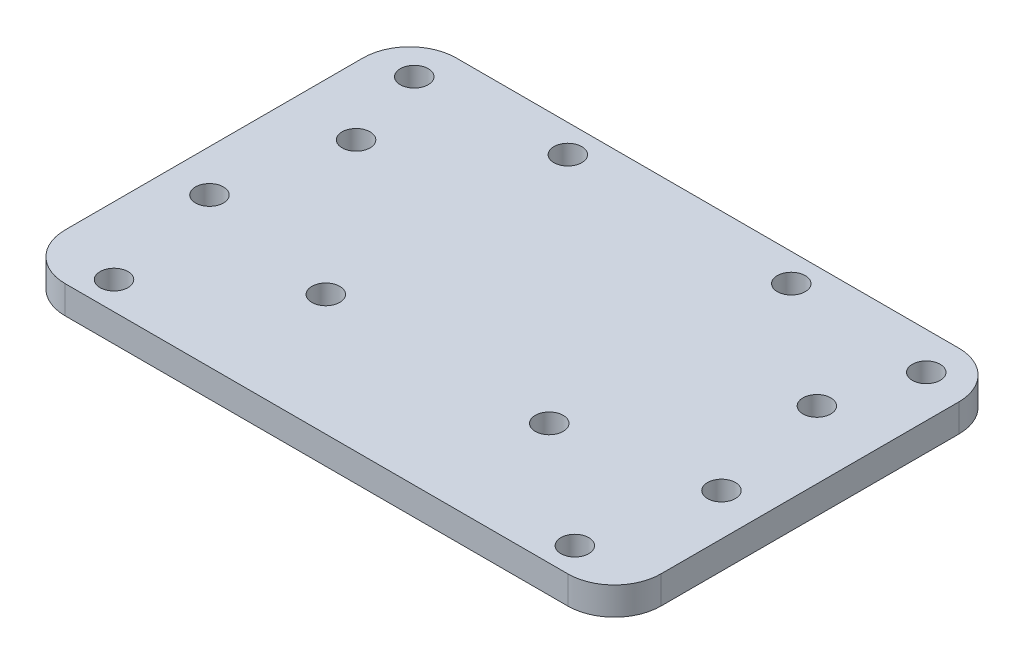
ISO-10303-21;
HEADER;
FILE_DESCRIPTION(('STEP AP214'),'2;1');
FILE_NAME('part.step','',(''),(''),'','','');
FILE_SCHEMA(('AUTOMOTIVE_DESIGN { 1 0 10303 214 1 1 1 1 }'));
ENDSEC;
DATA;
#1=APPLICATION_CONTEXT('core data for automotive mechanical design processes');
#2=APPLICATION_PROTOCOL_DEFINITION('international standard','automotive_design',2000,#1);
#3=PRODUCT_CONTEXT('',#1,'mechanical');
#4=PRODUCT('Part','Part','',(#3));
#5=PRODUCT_RELATED_PRODUCT_CATEGORY('part','',(#4));
#6=PRODUCT_DEFINITION_FORMATION('','',#4);
#7=PRODUCT_DEFINITION_CONTEXT('part definition',#1,'design');
#8=PRODUCT_DEFINITION('design','',#6,#7);
#9=PRODUCT_DEFINITION_SHAPE('','',#8);
#10=(LENGTH_UNIT() NAMED_UNIT(*) SI_UNIT(.MILLI.,.METRE.));
#11=(NAMED_UNIT(*) PLANE_ANGLE_UNIT() SI_UNIT($,.RADIAN.));
#12=(NAMED_UNIT(*) SI_UNIT($,.STERADIAN.) SOLID_ANGLE_UNIT());
#13=UNCERTAINTY_MEASURE_WITH_UNIT(LENGTH_MEASURE(1.E-05),#10,'distance_accuracy_value','');
#14=(GEOMETRIC_REPRESENTATION_CONTEXT(3) GLOBAL_UNCERTAINTY_ASSIGNED_CONTEXT((#13)) GLOBAL_UNIT_ASSIGNED_CONTEXT((#10,
#11,#12)) REPRESENTATION_CONTEXT('',''));
#15=CARTESIAN_POINT('',(0.,0.,0.));
#16=DIRECTION('',(0.,0.,1.));
#17=DIRECTION('',(1.,0.,0.));
#18=AXIS2_PLACEMENT_3D('',#15,#16,#17);
#19=CARTESIAN_POINT('',(-32.,3.,0.));
#20=DIRECTION('',(-1.,0.,0.));
#21=DIRECTION('',(0.,0.,1.));
#22=AXIS2_PLACEMENT_3D('',#19,#20,#21);
#23=PLANE('',#22);
#24=DIRECTION('',(0.,0.,-1.));
#25=VECTOR('',#24,1.);
#26=CARTESIAN_POINT('',(-32.,0.,0.));
#27=LINE('',#26,#25);
#28=CARTESIAN_POINT('',(-32.,0.,21.));
#29=VERTEX_POINT('',#28);
#30=CARTESIAN_POINT('',(-32.,0.,-11.));
#31=VERTEX_POINT('',#30);
#32=EDGE_CURVE('E136',#29,#31,#27,.T.);
#33=ORIENTED_EDGE('',*,*,#32,.F.);
#34=DIRECTION('',(0.,-1.,0.));
#35=VECTOR('',#34,1.);
#36=CARTESIAN_POINT('',(-32.,3.,21.));
#37=LINE('',#36,#35);
#38=CARTESIAN_POINT('',(-32.,3.,21.));
#39=VERTEX_POINT('',#38);
#40=EDGE_CURVE('E113',#29,#39,#37,.F.);
#41=ORIENTED_EDGE('',*,*,#40,.T.);
#42=DIRECTION('',(0.,0.,-1.));
#43=VECTOR('',#42,1.);
#44=CARTESIAN_POINT('',(-32.,3.,0.));
#45=LINE('',#44,#43);
#46=CARTESIAN_POINT('',(-32.,3.,-11.));
#47=VERTEX_POINT('',#46);
#48=EDGE_CURVE('E323',#39,#47,#45,.T.);
#49=ORIENTED_EDGE('',*,*,#48,.T.);
#50=DIRECTION('',(0.,-1.,0.));
#51=VECTOR('',#50,1.);
#52=CARTESIAN_POINT('',(-32.,3.,-11.));
#53=LINE('',#52,#51);
#54=EDGE_CURVE('E118',#47,#31,#53,.T.);
#55=ORIENTED_EDGE('',*,*,#54,.T.);
#56=EDGE_LOOP('',(#33,#41,#49,#55));
#57=FACE_BOUND('',#56,.T.);
#58=ADVANCED_FACE('F42',(#57),#23,.T.);
#59=CARTESIAN_POINT('',(0.,3.,26.));
#60=DIRECTION('',(0.,0.,-1.));
#61=DIRECTION('',(-1.,0.,0.));
#62=AXIS2_PLACEMENT_3D('',#59,#60,#61);
#63=PLANE('',#62);
#64=DIRECTION('',(1.,0.,0.));
#65=VECTOR('',#64,1.);
#66=CARTESIAN_POINT('',(0.,3.,26.));
#67=LINE('',#66,#65);
#68=CARTESIAN_POINT('',(-27.,3.,26.));
#69=VERTEX_POINT('',#68);
#70=CARTESIAN_POINT('',(27.,3.,26.));
#71=VERTEX_POINT('',#70);
#72=EDGE_CURVE('E128',#69,#71,#67,.T.);
#73=ORIENTED_EDGE('',*,*,#72,.F.);
#74=DIRECTION('',(0.,-1.,0.));
#75=VECTOR('',#74,1.);
#76=CARTESIAN_POINT('',(-27.,0.,26.));
#77=LINE('',#76,#75);
#78=CARTESIAN_POINT('',(-27.,0.,26.));
#79=VERTEX_POINT('',#78);
#80=EDGE_CURVE('E112',#69,#79,#77,.T.);
#81=ORIENTED_EDGE('',*,*,#80,.T.);
#82=DIRECTION('',(1.,0.,0.));
#83=VECTOR('',#82,1.);
#84=CARTESIAN_POINT('',(0.,0.,26.));
#85=LINE('',#84,#83);
#86=CARTESIAN_POINT('',(27.,0.,26.));
#87=VERTEX_POINT('',#86);
#88=EDGE_CURVE('E125',#79,#87,#85,.T.);
#89=ORIENTED_EDGE('',*,*,#88,.T.);
#90=DIRECTION('',(0.,-1.,0.));
#91=VECTOR('',#90,1.);
#92=CARTESIAN_POINT('',(27.,3.,26.));
#93=LINE('',#92,#91);
#94=EDGE_CURVE('E130',#87,#71,#93,.F.);
#95=ORIENTED_EDGE('',*,*,#94,.T.);
#96=EDGE_LOOP('',(#73,#81,#89,#95));
#97=FACE_BOUND('',#96,.T.);
#98=ADVANCED_FACE('F124',(#97),#63,.F.);
#99=CARTESIAN_POINT('',(32.,3.,0.));
#100=DIRECTION('',(-1.,0.,0.));
#101=DIRECTION('',(0.,0.,1.));
#102=AXIS2_PLACEMENT_3D('',#99,#100,#101);
#103=PLANE('',#102);
#104=DIRECTION('',(0.,0.,-1.));
#105=VECTOR('',#104,1.);
#106=CARTESIAN_POINT('',(32.,3.,0.));
#107=LINE('',#106,#105);
#108=CARTESIAN_POINT('',(32.,3.,21.));
#109=VERTEX_POINT('',#108);
#110=CARTESIAN_POINT('',(32.,3.,-11.));
#111=VERTEX_POINT('',#110);
#112=EDGE_CURVE('E194',#109,#111,#107,.T.);
#113=ORIENTED_EDGE('',*,*,#112,.F.);
#114=DIRECTION('',(0.,-1.,0.));
#115=VECTOR('',#114,1.);
#116=CARTESIAN_POINT('',(32.,3.,21.));
#117=LINE('',#116,#115);
#118=CARTESIAN_POINT('',(32.,0.,21.));
#119=VERTEX_POINT('',#118);
#120=EDGE_CURVE('E187',#109,#119,#117,.T.);
#121=ORIENTED_EDGE('',*,*,#120,.T.);
#122=DIRECTION('',(0.,0.,-1.));
#123=VECTOR('',#122,1.);
#124=CARTESIAN_POINT('',(32.,0.,0.));
#125=LINE('',#124,#123);
#126=CARTESIAN_POINT('',(32.,0.,-11.));
#127=VERTEX_POINT('',#126);
#128=EDGE_CURVE('E135',#119,#127,#125,.T.);
#129=ORIENTED_EDGE('',*,*,#128,.T.);
#130=DIRECTION('',(0.,-1.,0.));
#131=VECTOR('',#130,1.);
#132=CARTESIAN_POINT('',(32.,3.,-11.));
#133=LINE('',#132,#131);
#134=EDGE_CURVE('E185',#127,#111,#133,.F.);
#135=ORIENTED_EDGE('',*,*,#134,.T.);
#136=EDGE_LOOP('',(#113,#121,#129,#135));
#137=FACE_BOUND('',#136,.T.);
#138=ADVANCED_FACE('F192',(#137),#103,.F.);
#139=CARTESIAN_POINT('',(-24.75,3.,23.));
#140=DIRECTION('',(0.,-1.,0.));
#141=DIRECTION('',(0.,0.,-1.));
#142=AXIS2_PLACEMENT_3D('',#139,#140,#141);
#143=CYLINDRICAL_SURFACE('',#142,1.5);
#144=CARTESIAN_POINT('',(-24.75,3.,23.));
#145=DIRECTION('',(0.,1.,0.));
#146=DIRECTION('',(0.,0.,1.));
#147=AXIS2_PLACEMENT_3D('',#144,#145,#146);
#148=CIRCLE('',#147,1.5);
#149=CARTESIAN_POINT('',(-24.75,3.,24.5));
#150=VERTEX_POINT('',#149);
#151=EDGE_CURVE('E222',#150,#150,#148,.T.);
#152=ORIENTED_EDGE('',*,*,#151,.T.);
#153=EDGE_LOOP('',(#152));
#154=FACE_BOUND('',#153,.T.);
#155=CARTESIAN_POINT('',(-24.75,0.,23.));
#156=DIRECTION('',(0.,1.,0.));
#157=DIRECTION('',(0.,0.,1.));
#158=AXIS2_PLACEMENT_3D('',#155,#156,#157);
#159=CIRCLE('',#158,1.5);
#160=CARTESIAN_POINT('',(-24.75,0.,24.5));
#161=VERTEX_POINT('',#160);
#162=EDGE_CURVE('E162',#161,#161,#159,.T.);
#163=ORIENTED_EDGE('',*,*,#162,.F.);
#164=EDGE_LOOP('',(#163));
#165=FACE_BOUND('',#164,.T.);
#166=ADVANCED_FACE('F266',(#154,#165),#143,.F.);
#167=CARTESIAN_POINT('',(-12.,3.,-13.));
#168=DIRECTION('',(0.,-1.,0.));
#169=DIRECTION('',(0.,0.,-1.));
#170=AXIS2_PLACEMENT_3D('',#167,#168,#169);
#171=CYLINDRICAL_SURFACE('',#170,1.5);
#172=CARTESIAN_POINT('',(-12.,3.,-13.));
#173=DIRECTION('',(0.,1.,0.));
#174=DIRECTION('',(0.,0.,1.));
#175=AXIS2_PLACEMENT_3D('',#172,#173,#174);
#176=CIRCLE('',#175,1.5);
#177=CARTESIAN_POINT('',(-12.,3.,-11.5));
#178=VERTEX_POINT('',#177);
#179=EDGE_CURVE('E219',#178,#178,#176,.F.);
#180=ORIENTED_EDGE('',*,*,#179,.F.);
#181=EDGE_LOOP('',(#180));
#182=FACE_BOUND('',#181,.T.);
#183=CARTESIAN_POINT('',(-12.,0.,-13.));
#184=DIRECTION('',(0.,1.,0.));
#185=DIRECTION('',(0.,0.,1.));
#186=AXIS2_PLACEMENT_3D('',#183,#184,#185);
#187=CIRCLE('',#186,1.5);
#188=CARTESIAN_POINT('',(-12.,0.,-11.5));
#189=VERTEX_POINT('',#188);
#190=EDGE_CURVE('E159',#189,#189,#187,.F.);
#191=ORIENTED_EDGE('',*,*,#190,.T.);
#192=EDGE_LOOP('',(#191));
#193=FACE_BOUND('',#192,.T.);
#194=ADVANCED_FACE('F282',(#182,#193),#171,.F.);
#195=CARTESIAN_POINT('',(-12.,3.,13.));
#196=DIRECTION('',(0.,-1.,0.));
#197=DIRECTION('',(0.,0.,-1.));
#198=AXIS2_PLACEMENT_3D('',#195,#196,#197);
#199=CYLINDRICAL_SURFACE('',#198,1.5);
#200=CARTESIAN_POINT('',(-12.,3.,13.));
#201=DIRECTION('',(0.,1.,0.));
#202=DIRECTION('',(0.,0.,1.));
#203=AXIS2_PLACEMENT_3D('',#200,#201,#202);
#204=CIRCLE('',#203,1.5);
#205=CARTESIAN_POINT('',(-12.,3.,14.5));
#206=VERTEX_POINT('',#205);
#207=EDGE_CURVE('E216',#206,#206,#204,.T.);
#208=ORIENTED_EDGE('',*,*,#207,.T.);
#209=EDGE_LOOP('',(#208));
#210=FACE_BOUND('',#209,.T.);
#211=CARTESIAN_POINT('',(-12.,0.,13.));
#212=DIRECTION('',(0.,1.,0.));
#213=DIRECTION('',(0.,0.,1.));
#214=AXIS2_PLACEMENT_3D('',#211,#212,#213);
#215=CIRCLE('',#214,1.5);
#216=CARTESIAN_POINT('',(-12.,0.,14.5));
#217=VERTEX_POINT('',#216);
#218=EDGE_CURVE('E156',#217,#217,#215,.T.);
#219=ORIENTED_EDGE('',*,*,#218,.F.);
#220=EDGE_LOOP('',(#219));
#221=FACE_BOUND('',#220,.T.);
#222=ADVANCED_FACE('F278',(#210,#221),#199,.F.);
#223=CARTESIAN_POINT('',(-24.75,3.,-3.));
#224=DIRECTION('',(0.,-1.,0.));
#225=DIRECTION('',(0.,0.,-1.));
#226=AXIS2_PLACEMENT_3D('',#223,#224,#225);
#227=CYLINDRICAL_SURFACE('',#226,1.5);
#228=CARTESIAN_POINT('',(-24.75,3.,-3.));
#229=DIRECTION('',(0.,1.,0.));
#230=DIRECTION('',(0.,0.,1.));
#231=AXIS2_PLACEMENT_3D('',#228,#229,#230);
#232=CIRCLE('',#231,1.5);
#233=CARTESIAN_POINT('',(-24.75,3.,-1.5));
#234=VERTEX_POINT('',#233);
#235=EDGE_CURVE('E213',#234,#234,#232,.F.);
#236=ORIENTED_EDGE('',*,*,#235,.F.);
#237=EDGE_LOOP('',(#236));
#238=FACE_BOUND('',#237,.T.);
#239=CARTESIAN_POINT('',(-24.75,0.,-3.));
#240=DIRECTION('',(0.,1.,0.));
#241=DIRECTION('',(0.,0.,1.));
#242=AXIS2_PLACEMENT_3D('',#239,#240,#241);
#243=CIRCLE('',#242,1.5);
#244=CARTESIAN_POINT('',(-24.75,0.,-1.5));
#245=VERTEX_POINT('',#244);
#246=EDGE_CURVE('E153',#245,#245,#243,.F.);
#247=ORIENTED_EDGE('',*,*,#246,.T.);
#248=EDGE_LOOP('',(#247));
#249=FACE_BOUND('',#248,.T.);
#250=ADVANCED_FACE('F274',(#238,#249),#227,.F.);
#251=CARTESIAN_POINT('',(-27.5,3.,-12.));
#252=DIRECTION('',(0.,-1.,0.));
#253=DIRECTION('',(0.,0.,-1.));
#254=AXIS2_PLACEMENT_3D('',#251,#252,#253);
#255=CYLINDRICAL_SURFACE('',#254,1.5);
#256=CARTESIAN_POINT('',(-27.5,3.,-12.));
#257=DIRECTION('',(0.,1.,0.));
#258=DIRECTION('',(0.,0.,1.));
#259=AXIS2_PLACEMENT_3D('',#256,#257,#258);
#260=CIRCLE('',#259,1.5);
#261=CARTESIAN_POINT('',(-27.5,3.,-10.5));
#262=VERTEX_POINT('',#261);
#263=EDGE_CURVE('E206',#262,#262,#260,.F.);
#264=ORIENTED_EDGE('',*,*,#263,.F.);
#265=EDGE_LOOP('',(#264));
#266=FACE_BOUND('',#265,.T.);
#267=CARTESIAN_POINT('',(-27.5,0.,-12.));
#268=DIRECTION('',(0.,1.,0.));
#269=DIRECTION('',(0.,0.,1.));
#270=AXIS2_PLACEMENT_3D('',#267,#268,#269);
#271=CIRCLE('',#270,1.5);
#272=CARTESIAN_POINT('',(-27.5,0.,-10.5));
#273=VERTEX_POINT('',#272);
#274=EDGE_CURVE('E150',#273,#273,#271,.F.);
#275=ORIENTED_EDGE('',*,*,#274,.T.);
#276=EDGE_LOOP('',(#275));
#277=FACE_BOUND('',#276,.T.);
#278=ADVANCED_FACE('F270',(#266,#277),#255,.F.);
#279=CARTESIAN_POINT('',(27.5,3.,-12.));
#280=DIRECTION('',(0.,-1.,0.));
#281=DIRECTION('',(0.,0.,-1.));
#282=AXIS2_PLACEMENT_3D('',#279,#280,#281);
#283=CYLINDRICAL_SURFACE('',#282,1.5);
#284=CARTESIAN_POINT('',(27.5,3.,-12.));
#285=DIRECTION('',(0.,1.,0.));
#286=DIRECTION('',(0.,0.,1.));
#287=AXIS2_PLACEMENT_3D('',#284,#285,#286);
#288=CIRCLE('',#287,1.5);
#289=CARTESIAN_POINT('',(27.5,3.,-10.5));
#290=VERTEX_POINT('',#289);
#291=EDGE_CURVE('E203',#290,#290,#288,.T.);
#292=ORIENTED_EDGE('',*,*,#291,.T.);
#293=EDGE_LOOP('',(#292));
#294=FACE_BOUND('',#293,.T.);
#295=CARTESIAN_POINT('',(27.5,0.,-12.));
#296=DIRECTION('',(0.,1.,0.));
#297=DIRECTION('',(0.,0.,1.));
#298=AXIS2_PLACEMENT_3D('',#295,#296,#297);
#299=CIRCLE('',#298,1.5);
#300=CARTESIAN_POINT('',(27.5,0.,-10.5));
#301=VERTEX_POINT('',#300);
#302=EDGE_CURVE('E147',#301,#301,#299,.T.);
#303=ORIENTED_EDGE('',*,*,#302,.F.);
#304=EDGE_LOOP('',(#303));
#305=FACE_BOUND('',#304,.T.);
#306=ADVANCED_FACE('F254',(#294,#305),#283,.F.);
#307=CARTESIAN_POINT('',(0.,3.,-16.));
#308=DIRECTION('',(0.,0.,-1.));
#309=DIRECTION('',(-1.,0.,0.));
#310=AXIS2_PLACEMENT_3D('',#307,#308,#309);
#311=PLANE('',#310);
#312=DIRECTION('',(1.,0.,0.));
#313=VECTOR('',#312,1.);
#314=CARTESIAN_POINT('',(0.,3.,-16.));
#315=LINE('',#314,#313);
#316=CARTESIAN_POINT('',(-27.,3.,-16.));
#317=VERTEX_POINT('',#316);
#318=CARTESIAN_POINT('',(27.,3.,-16.));
#319=VERTEX_POINT('',#318);
#320=EDGE_CURVE('E201',#317,#319,#315,.T.);
#321=ORIENTED_EDGE('',*,*,#320,.T.);
#322=DIRECTION('',(0.,-1.,0.));
#323=VECTOR('',#322,1.);
#324=CARTESIAN_POINT('',(27.,0.,-16.));
#325=LINE('',#324,#323);
#326=CARTESIAN_POINT('',(27.,0.,-16.));
#327=VERTEX_POINT('',#326);
#328=EDGE_CURVE('E11',#319,#327,#325,.T.);
#329=ORIENTED_EDGE('',*,*,#328,.T.);
#330=DIRECTION('',(1.,0.,0.));
#331=VECTOR('',#330,1.);
#332=CARTESIAN_POINT('',(0.,0.,-16.));
#333=LINE('',#332,#331);
#334=CARTESIAN_POINT('',(-27.,0.,-16.));
#335=VERTEX_POINT('',#334);
#336=EDGE_CURVE('E139',#335,#327,#333,.T.);
#337=ORIENTED_EDGE('',*,*,#336,.F.);
#338=DIRECTION('',(0.,-1.,0.));
#339=VECTOR('',#338,1.);
#340=CARTESIAN_POINT('',(-27.,3.,-16.));
#341=LINE('',#340,#339);
#342=EDGE_CURVE('E50',#335,#317,#341,.F.);
#343=ORIENTED_EDGE('',*,*,#342,.T.);
#344=EDGE_LOOP('',(#321,#329,#337,#343));
#345=FACE_BOUND('',#344,.T.);
#346=ADVANCED_FACE('F200',(#345),#311,.T.);
#347=CARTESIAN_POINT('',(27.5,3.,10.));
#348=DIRECTION('',(0.,-1.,0.));
#349=DIRECTION('',(0.,0.,-1.));
#350=AXIS2_PLACEMENT_3D('',#347,#348,#349);
#351=CYLINDRICAL_SURFACE('',#350,1.5);
#352=CARTESIAN_POINT('',(27.5,3.,10.));
#353=DIRECTION('',(0.,1.,0.));
#354=DIRECTION('',(0.,0.,1.));
#355=AXIS2_PLACEMENT_3D('',#352,#353,#354);
#356=CIRCLE('',#355,1.5);
#357=CARTESIAN_POINT('',(27.5,3.,11.5));
#358=VERTEX_POINT('',#357);
#359=EDGE_CURVE('E319',#358,#358,#356,.T.);
#360=ORIENTED_EDGE('',*,*,#359,.T.);
#361=EDGE_LOOP('',(#360));
#362=FACE_BOUND('',#361,.T.);
#363=CARTESIAN_POINT('',(27.5,0.,10.));
#364=DIRECTION('',(0.,1.,0.));
#365=DIRECTION('',(0.,0.,1.));
#366=AXIS2_PLACEMENT_3D('',#363,#364,#365);
#367=CIRCLE('',#366,1.5);
#368=CARTESIAN_POINT('',(27.5,0.,11.5));
#369=VERTEX_POINT('',#368);
#370=EDGE_CURVE('E141',#369,#369,#367,.T.);
#371=ORIENTED_EDGE('',*,*,#370,.F.);
#372=EDGE_LOOP('',(#371));
#373=FACE_BOUND('',#372,.T.);
#374=ADVANCED_FACE('F242',(#362,#373),#351,.F.);
#375=CARTESIAN_POINT('',(24.75,3.,-3.));
#376=DIRECTION('',(0.,-1.,0.));
#377=DIRECTION('',(0.,0.,-1.));
#378=AXIS2_PLACEMENT_3D('',#375,#376,#377);
#379=CYLINDRICAL_SURFACE('',#378,1.5);
#380=CARTESIAN_POINT('',(24.75,3.,-3.));
#381=DIRECTION('',(0.,1.,0.));
#382=DIRECTION('',(0.,0.,1.));
#383=AXIS2_PLACEMENT_3D('',#380,#381,#382);
#384=CIRCLE('',#383,1.5);
#385=CARTESIAN_POINT('',(24.75,3.,-1.5));
#386=VERTEX_POINT('',#385);
#387=EDGE_CURVE('E317',#386,#386,#384,.T.);
#388=ORIENTED_EDGE('',*,*,#387,.T.);
#389=EDGE_LOOP('',(#388));
#390=FACE_BOUND('',#389,.T.);
#391=CARTESIAN_POINT('',(24.75,0.,-3.));
#392=DIRECTION('',(0.,1.,0.));
#393=DIRECTION('',(0.,0.,1.));
#394=AXIS2_PLACEMENT_3D('',#391,#392,#393);
#395=CIRCLE('',#394,1.5);
#396=CARTESIAN_POINT('',(24.75,0.,-1.5));
#397=VERTEX_POINT('',#396);
#398=EDGE_CURVE('E236',#397,#397,#395,.T.);
#399=ORIENTED_EDGE('',*,*,#398,.F.);
#400=EDGE_LOOP('',(#399));
#401=FACE_BOUND('',#400,.T.);
#402=ADVANCED_FACE('F244',(#390,#401),#379,.F.);
#403=CARTESIAN_POINT('',(-27.5,3.,10.));
#404=DIRECTION('',(0.,-1.,0.));
#405=DIRECTION('',(0.,0.,-1.));
#406=AXIS2_PLACEMENT_3D('',#403,#404,#405);
#407=CYLINDRICAL_SURFACE('',#406,1.5);
#408=CARTESIAN_POINT('',(-27.5,3.,10.));
#409=DIRECTION('',(0.,1.,0.));
#410=DIRECTION('',(0.,0.,1.));
#411=AXIS2_PLACEMENT_3D('',#408,#409,#410);
#412=CIRCLE('',#411,1.5);
#413=CARTESIAN_POINT('',(-27.5,3.,11.5));
#414=VERTEX_POINT('',#413);
#415=EDGE_CURVE('E313',#414,#414,#412,.F.);
#416=ORIENTED_EDGE('',*,*,#415,.F.);
#417=EDGE_LOOP('',(#416));
#418=FACE_BOUND('',#417,.T.);
#419=CARTESIAN_POINT('',(-27.5,0.,10.));
#420=DIRECTION('',(0.,1.,0.));
#421=DIRECTION('',(0.,0.,1.));
#422=AXIS2_PLACEMENT_3D('',#419,#420,#421);
#423=CIRCLE('',#422,1.5);
#424=CARTESIAN_POINT('',(-27.5,0.,11.5));
#425=VERTEX_POINT('',#424);
#426=EDGE_CURVE('E233',#425,#425,#423,.F.);
#427=ORIENTED_EDGE('',*,*,#426,.T.);
#428=EDGE_LOOP('',(#427));
#429=FACE_BOUND('',#428,.T.);
#430=ADVANCED_FACE('F251',(#418,#429),#407,.F.);
#431=CARTESIAN_POINT('',(12.,3.,-13.));
#432=DIRECTION('',(0.,-1.,0.));
#433=DIRECTION('',(0.,0.,-1.));
#434=AXIS2_PLACEMENT_3D('',#431,#432,#433);
#435=CYLINDRICAL_SURFACE('',#434,1.5);
#436=CARTESIAN_POINT('',(12.,3.,-13.));
#437=DIRECTION('',(0.,1.,0.));
#438=DIRECTION('',(0.,0.,1.));
#439=AXIS2_PLACEMENT_3D('',#436,#437,#438);
#440=CIRCLE('',#439,1.5);
#441=CARTESIAN_POINT('',(12.,3.,-11.5));
#442=VERTEX_POINT('',#441);
#443=EDGE_CURVE('E309',#442,#442,#440,.T.);
#444=ORIENTED_EDGE('',*,*,#443,.T.);
#445=EDGE_LOOP('',(#444));
#446=FACE_BOUND('',#445,.T.);
#447=CARTESIAN_POINT('',(12.,0.,-13.));
#448=DIRECTION('',(0.,1.,0.));
#449=DIRECTION('',(0.,0.,1.));
#450=AXIS2_PLACEMENT_3D('',#447,#448,#449);
#451=CIRCLE('',#450,1.5);
#452=CARTESIAN_POINT('',(12.,0.,-11.5));
#453=VERTEX_POINT('',#452);
#454=EDGE_CURVE('E230',#453,#453,#451,.T.);
#455=ORIENTED_EDGE('',*,*,#454,.F.);
#456=EDGE_LOOP('',(#455));
#457=FACE_BOUND('',#456,.T.);
#458=ADVANCED_FACE('F365',(#446,#457),#435,.F.);
#459=CARTESIAN_POINT('',(12.,3.,13.));
#460=DIRECTION('',(0.,-1.,0.));
#461=DIRECTION('',(0.,0.,-1.));
#462=AXIS2_PLACEMENT_3D('',#459,#460,#461);
#463=CYLINDRICAL_SURFACE('',#462,1.5);
#464=CARTESIAN_POINT('',(12.,3.,13.));
#465=DIRECTION('',(0.,1.,0.));
#466=DIRECTION('',(0.,0.,1.));
#467=AXIS2_PLACEMENT_3D('',#464,#465,#466);
#468=CIRCLE('',#467,1.5);
#469=CARTESIAN_POINT('',(12.,3.,14.5));
#470=VERTEX_POINT('',#469);
#471=EDGE_CURVE('E168',#470,#470,#468,.F.);
#472=ORIENTED_EDGE('',*,*,#471,.F.);
#473=EDGE_LOOP('',(#472));
#474=FACE_BOUND('',#473,.T.);
#475=CARTESIAN_POINT('',(12.,0.,13.));
#476=DIRECTION('',(0.,1.,0.));
#477=DIRECTION('',(0.,0.,1.));
#478=AXIS2_PLACEMENT_3D('',#475,#476,#477);
#479=CIRCLE('',#478,1.5);
#480=CARTESIAN_POINT('',(12.,0.,14.5));
#481=VERTEX_POINT('',#480);
#482=EDGE_CURVE('E227',#481,#481,#479,.F.);
#483=ORIENTED_EDGE('',*,*,#482,.T.);
#484=EDGE_LOOP('',(#483));
#485=FACE_BOUND('',#484,.T.);
#486=ADVANCED_FACE('F294',(#474,#485),#463,.F.);
#487=CARTESIAN_POINT('',(24.75,3.,23.));
#488=DIRECTION('',(0.,-1.,0.));
#489=DIRECTION('',(0.,0.,-1.));
#490=AXIS2_PLACEMENT_3D('',#487,#488,#489);
#491=CYLINDRICAL_SURFACE('',#490,1.5);
#492=CARTESIAN_POINT('',(24.75,3.,23.));
#493=DIRECTION('',(0.,1.,0.));
#494=DIRECTION('',(0.,0.,1.));
#495=AXIS2_PLACEMENT_3D('',#492,#493,#494);
#496=CIRCLE('',#495,1.5);
#497=CARTESIAN_POINT('',(24.75,3.,24.5));
#498=VERTEX_POINT('',#497);
#499=EDGE_CURVE('E169',#498,#498,#496,.F.);
#500=ORIENTED_EDGE('',*,*,#499,.F.);
#501=EDGE_LOOP('',(#500));
#502=FACE_BOUND('',#501,.T.);
#503=CARTESIAN_POINT('',(24.75,0.,23.));
#504=DIRECTION('',(0.,1.,0.));
#505=DIRECTION('',(0.,0.,1.));
#506=AXIS2_PLACEMENT_3D('',#503,#504,#505);
#507=CIRCLE('',#506,1.5);
#508=CARTESIAN_POINT('',(24.75,0.,24.5));
#509=VERTEX_POINT('',#508);
#510=EDGE_CURVE('E165',#509,#509,#507,.F.);
#511=ORIENTED_EDGE('',*,*,#510,.T.);
#512=EDGE_LOOP('',(#511));
#513=FACE_BOUND('',#512,.T.);
#514=ADVANCED_FACE('F290',(#502,#513),#491,.F.);
#515=CARTESIAN_POINT('',(0.,3.,0.));
#516=DIRECTION('',(0.,1.,0.));
#517=DIRECTION('',(0.,0.,1.));
#518=AXIS2_PLACEMENT_3D('',#515,#516,#517);
#519=PLANE('',#518);
#520=ORIENTED_EDGE('',*,*,#471,.T.);
#521=EDGE_LOOP('',(#520));
#522=FACE_BOUND('',#521,.T.);
#523=ORIENTED_EDGE('',*,*,#443,.F.);
#524=EDGE_LOOP('',(#523));
#525=FACE_BOUND('',#524,.T.);
#526=ORIENTED_EDGE('',*,*,#415,.T.);
#527=EDGE_LOOP('',(#526));
#528=FACE_BOUND('',#527,.T.);
#529=ORIENTED_EDGE('',*,*,#387,.F.);
#530=EDGE_LOOP('',(#529));
#531=FACE_BOUND('',#530,.T.);
#532=ORIENTED_EDGE('',*,*,#359,.F.);
#533=EDGE_LOOP('',(#532));
#534=FACE_BOUND('',#533,.T.);
#535=ORIENTED_EDGE('',*,*,#48,.F.);
#536=CARTESIAN_POINT('',(-27.,3.,21.));
#537=DIRECTION('',(0.,1.,0.));
#538=DIRECTION('',(0.,0.,1.));
#539=AXIS2_PLACEMENT_3D('',#536,#537,#538);
#540=CIRCLE('',#539,5.);
#541=EDGE_CURVE('E183',#39,#69,#540,.T.);
#542=ORIENTED_EDGE('',*,*,#541,.T.);
#543=ORIENTED_EDGE('',*,*,#72,.T.);
#544=CARTESIAN_POINT('',(27.,3.,21.));
#545=DIRECTION('',(0.,1.,0.));
#546=DIRECTION('',(0.,0.,1.));
#547=AXIS2_PLACEMENT_3D('',#544,#545,#546);
#548=CIRCLE('',#547,5.);
#549=EDGE_CURVE('E181',#71,#109,#548,.T.);
#550=ORIENTED_EDGE('',*,*,#549,.T.);
#551=ORIENTED_EDGE('',*,*,#112,.T.);
#552=CARTESIAN_POINT('',(27.,3.,-11.));
#553=DIRECTION('',(0.,1.,0.));
#554=DIRECTION('',(0.,0.,1.));
#555=AXIS2_PLACEMENT_3D('',#552,#553,#554);
#556=CIRCLE('',#555,5.);
#557=EDGE_CURVE('E57',#111,#319,#556,.T.);
#558=ORIENTED_EDGE('',*,*,#557,.T.);
#559=ORIENTED_EDGE('',*,*,#320,.F.);
#560=CARTESIAN_POINT('',(-27.,3.,-11.));
#561=DIRECTION('',(0.,1.,0.));
#562=DIRECTION('',(0.,0.,1.));
#563=AXIS2_PLACEMENT_3D('',#560,#561,#562);
#564=CIRCLE('',#563,5.);
#565=EDGE_CURVE('E178',#317,#47,#564,.T.);
#566=ORIENTED_EDGE('',*,*,#565,.T.);
#567=EDGE_LOOP('',(#535,#542,#543,#550,#551,#558,#559,#566));
#568=FACE_BOUND('',#567,.T.);
#569=ORIENTED_EDGE('',*,*,#291,.F.);
#570=EDGE_LOOP('',(#569));
#571=FACE_BOUND('',#570,.T.);
#572=ORIENTED_EDGE('',*,*,#263,.T.);
#573=EDGE_LOOP('',(#572));
#574=FACE_BOUND('',#573,.T.);
#575=ORIENTED_EDGE('',*,*,#235,.T.);
#576=EDGE_LOOP('',(#575));
#577=FACE_BOUND('',#576,.T.);
#578=ORIENTED_EDGE('',*,*,#207,.F.);
#579=EDGE_LOOP('',(#578));
#580=FACE_BOUND('',#579,.T.);
#581=ORIENTED_EDGE('',*,*,#179,.T.);
#582=EDGE_LOOP('',(#581));
#583=FACE_BOUND('',#582,.T.);
#584=ORIENTED_EDGE('',*,*,#151,.F.);
#585=EDGE_LOOP('',(#584));
#586=FACE_BOUND('',#585,.T.);
#587=ORIENTED_EDGE('',*,*,#499,.T.);
#588=EDGE_LOOP('',(#587));
#589=FACE_BOUND('',#588,.T.);
#590=ADVANCED_FACE('F293',(#522,#525,#528,#531,#534,#568,#571,#574,#577,#580,#583,#586,#589),
#519,.T.);
#591=CARTESIAN_POINT('',(0.,0.,0.));
#592=DIRECTION('',(0.,1.,0.));
#593=DIRECTION('',(0.,0.,1.));
#594=AXIS2_PLACEMENT_3D('',#591,#592,#593);
#595=PLANE('',#594);
#596=ORIENTED_EDGE('',*,*,#482,.F.);
#597=EDGE_LOOP('',(#596));
#598=FACE_BOUND('',#597,.T.);
#599=ORIENTED_EDGE('',*,*,#454,.T.);
#600=EDGE_LOOP('',(#599));
#601=FACE_BOUND('',#600,.T.);
#602=ORIENTED_EDGE('',*,*,#426,.F.);
#603=EDGE_LOOP('',(#602));
#604=FACE_BOUND('',#603,.T.);
#605=ORIENTED_EDGE('',*,*,#398,.T.);
#606=EDGE_LOOP('',(#605));
#607=FACE_BOUND('',#606,.T.);
#608=ORIENTED_EDGE('',*,*,#370,.T.);
#609=EDGE_LOOP('',(#608));
#610=FACE_BOUND('',#609,.T.);
#611=ORIENTED_EDGE('',*,*,#88,.F.);
#612=CARTESIAN_POINT('',(-27.,0.,21.));
#613=DIRECTION('',(0.,1.,0.));
#614=DIRECTION('',(0.,0.,1.));
#615=AXIS2_PLACEMENT_3D('',#612,#613,#614);
#616=CIRCLE('',#615,5.);
#617=EDGE_CURVE('E108',#79,#29,#616,.F.);
#618=ORIENTED_EDGE('',*,*,#617,.T.);
#619=ORIENTED_EDGE('',*,*,#32,.T.);
#620=CARTESIAN_POINT('',(-27.,0.,-11.));
#621=DIRECTION('',(0.,1.,0.));
#622=DIRECTION('',(0.,0.,1.));
#623=AXIS2_PLACEMENT_3D('',#620,#621,#622);
#624=CIRCLE('',#623,5.);
#625=EDGE_CURVE('E129',#31,#335,#624,.F.);
#626=ORIENTED_EDGE('',*,*,#625,.T.);
#627=ORIENTED_EDGE('',*,*,#336,.T.);
#628=CARTESIAN_POINT('',(27.,0.,-11.));
#629=DIRECTION('',(0.,1.,0.));
#630=DIRECTION('',(0.,0.,1.));
#631=AXIS2_PLACEMENT_3D('',#628,#629,#630);
#632=CIRCLE('',#631,5.);
#633=EDGE_CURVE('E172',#327,#127,#632,.F.);
#634=ORIENTED_EDGE('',*,*,#633,.T.);
#635=ORIENTED_EDGE('',*,*,#128,.F.);
#636=CARTESIAN_POINT('',(27.,0.,21.));
#637=DIRECTION('',(0.,1.,0.));
#638=DIRECTION('',(0.,0.,1.));
#639=AXIS2_PLACEMENT_3D('',#636,#637,#638);
#640=CIRCLE('',#639,5.);
#641=EDGE_CURVE('E119',#119,#87,#640,.F.);
#642=ORIENTED_EDGE('',*,*,#641,.T.);
#643=EDGE_LOOP('',(#611,#618,#619,#626,#627,#634,#635,#642));
#644=FACE_BOUND('',#643,.T.);
#645=ORIENTED_EDGE('',*,*,#302,.T.);
#646=EDGE_LOOP('',(#645));
#647=FACE_BOUND('',#646,.T.);
#648=ORIENTED_EDGE('',*,*,#274,.F.);
#649=EDGE_LOOP('',(#648));
#650=FACE_BOUND('',#649,.T.);
#651=ORIENTED_EDGE('',*,*,#246,.F.);
#652=EDGE_LOOP('',(#651));
#653=FACE_BOUND('',#652,.T.);
#654=ORIENTED_EDGE('',*,*,#218,.T.);
#655=EDGE_LOOP('',(#654));
#656=FACE_BOUND('',#655,.T.);
#657=ORIENTED_EDGE('',*,*,#190,.F.);
#658=EDGE_LOOP('',(#657));
#659=FACE_BOUND('',#658,.T.);
#660=ORIENTED_EDGE('',*,*,#162,.T.);
#661=EDGE_LOOP('',(#660));
#662=FACE_BOUND('',#661,.T.);
#663=ORIENTED_EDGE('',*,*,#510,.F.);
#664=EDGE_LOOP('',(#663));
#665=FACE_BOUND('',#664,.T.);
#666=ADVANCED_FACE('F132',(#598,#601,#604,#607,#610,#644,#647,#650,#653,#656,#659,#662,#665),
#595,.F.);
#667=CARTESIAN_POINT('',(-27.,3.,21.));
#668=DIRECTION('',(0.,1.,0.));
#669=DIRECTION('',(0.,0.,1.));
#670=AXIS2_PLACEMENT_3D('',#667,#668,#669);
#671=CYLINDRICAL_SURFACE('',#670,5.);
#672=ORIENTED_EDGE('',*,*,#541,.F.);
#673=ORIENTED_EDGE('',*,*,#40,.F.);
#674=ORIENTED_EDGE('',*,*,#617,.F.);
#675=ORIENTED_EDGE('',*,*,#80,.F.);
#676=EDGE_LOOP('',(#672,#673,#674,#675));
#677=FACE_BOUND('',#676,.T.);
#678=ADVANCED_FACE('F111',(#677),#671,.T.);
#679=CARTESIAN_POINT('',(27.,3.,21.));
#680=DIRECTION('',(0.,-1.,0.));
#681=DIRECTION('',(0.,0.,-1.));
#682=AXIS2_PLACEMENT_3D('',#679,#680,#681);
#683=CYLINDRICAL_SURFACE('',#682,5.);
#684=ORIENTED_EDGE('',*,*,#549,.F.);
#685=ORIENTED_EDGE('',*,*,#94,.F.);
#686=ORIENTED_EDGE('',*,*,#641,.F.);
#687=ORIENTED_EDGE('',*,*,#120,.F.);
#688=EDGE_LOOP('',(#684,#685,#686,#687));
#689=FACE_BOUND('',#688,.T.);
#690=ADVANCED_FACE('F388',(#689),#683,.T.);
#691=CARTESIAN_POINT('',(27.,3.,-11.));
#692=DIRECTION('',(0.,1.,0.));
#693=DIRECTION('',(0.,0.,1.));
#694=AXIS2_PLACEMENT_3D('',#691,#692,#693);
#695=CYLINDRICAL_SURFACE('',#694,5.);
#696=ORIENTED_EDGE('',*,*,#557,.F.);
#697=ORIENTED_EDGE('',*,*,#134,.F.);
#698=ORIENTED_EDGE('',*,*,#633,.F.);
#699=ORIENTED_EDGE('',*,*,#328,.F.);
#700=EDGE_LOOP('',(#696,#697,#698,#699));
#701=FACE_BOUND('',#700,.T.);
#702=ADVANCED_FACE('F199',(#701),#695,.T.);
#703=CARTESIAN_POINT('',(-27.,3.,-11.));
#704=DIRECTION('',(0.,-1.,0.));
#705=DIRECTION('',(0.,0.,-1.));
#706=AXIS2_PLACEMENT_3D('',#703,#704,#705);
#707=CYLINDRICAL_SURFACE('',#706,5.);
#708=ORIENTED_EDGE('',*,*,#565,.F.);
#709=ORIENTED_EDGE('',*,*,#342,.F.);
#710=ORIENTED_EDGE('',*,*,#625,.F.);
#711=ORIENTED_EDGE('',*,*,#54,.F.);
#712=EDGE_LOOP('',(#708,#709,#710,#711));
#713=FACE_BOUND('',#712,.T.);
#714=ADVANCED_FACE('F44',(#713),#707,.T.);
#715=CLOSED_SHELL('',(#58,#98,#138,#166,#194,#222,#250,#278,#306,#346,#374,#402,#430,#458,#486,
#514,#590,#666,#678,#690,#702,#714));
#716=MANIFOLD_SOLID_BREP('B2',#715);
#717=ADVANCED_BREP_SHAPE_REPRESENTATION('',(#18,#716),#14);
#718=SHAPE_DEFINITION_REPRESENTATION(#9,#717);
ENDSEC;
END-ISO-10303-21;
